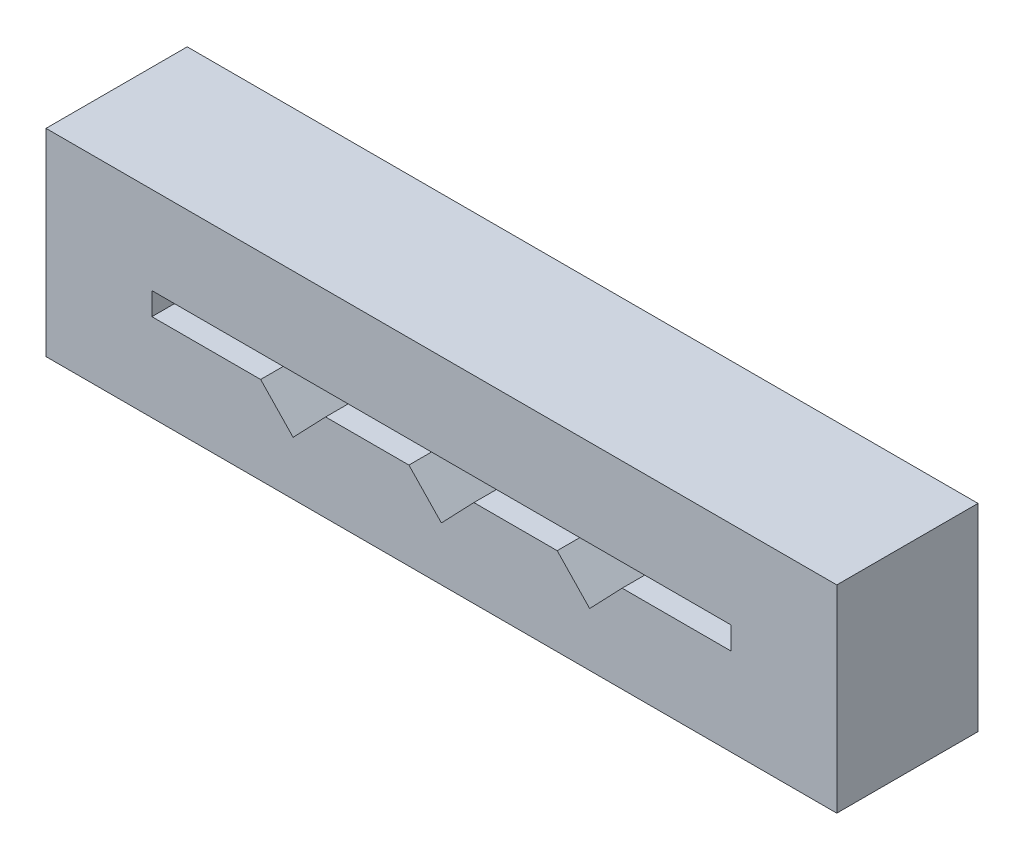
ISO-10303-21;
HEADER;
FILE_DESCRIPTION(('STEP AP214'),'2;1');
FILE_NAME('part.step','',(''),(''),'','','');
FILE_SCHEMA(('AUTOMOTIVE_DESIGN { 1 0 10303 214 1 1 1 1 }'));
ENDSEC;
DATA;
#1=APPLICATION_CONTEXT('core data for automotive mechanical design processes');
#2=APPLICATION_PROTOCOL_DEFINITION('international standard','automotive_design',2000,#1);
#3=PRODUCT_CONTEXT('',#1,'mechanical');
#4=PRODUCT('Part','Part','',(#3));
#5=PRODUCT_RELATED_PRODUCT_CATEGORY('part','',(#4));
#6=PRODUCT_DEFINITION_FORMATION('','',#4);
#7=PRODUCT_DEFINITION_CONTEXT('part definition',#1,'design');
#8=PRODUCT_DEFINITION('design','',#6,#7);
#9=PRODUCT_DEFINITION_SHAPE('','',#8);
#10=(LENGTH_UNIT() NAMED_UNIT(*) SI_UNIT(.MILLI.,.METRE.));
#11=(NAMED_UNIT(*) PLANE_ANGLE_UNIT() SI_UNIT($,.RADIAN.));
#12=(NAMED_UNIT(*) SI_UNIT($,.STERADIAN.) SOLID_ANGLE_UNIT());
#13=UNCERTAINTY_MEASURE_WITH_UNIT(LENGTH_MEASURE(1.E-05),#10,'distance_accuracy_value','');
#14=(GEOMETRIC_REPRESENTATION_CONTEXT(3) GLOBAL_UNCERTAINTY_ASSIGNED_CONTEXT((#13)) GLOBAL_UNIT_ASSIGNED_CONTEXT((#10,
#11,#12)) REPRESENTATION_CONTEXT('',''));
#15=CARTESIAN_POINT('',(0.,0.,0.));
#16=DIRECTION('',(0.,0.,1.));
#17=DIRECTION('',(1.,0.,0.));
#18=AXIS2_PLACEMENT_3D('',#15,#16,#17);
#19=CARTESIAN_POINT('',(-14.,3.5,5.));
#20=DIRECTION('',(1.,0.,0.));
#21=DIRECTION('',(0.,0.,-1.));
#22=AXIS2_PLACEMENT_3D('',#19,#20,#21);
#23=PLANE('',#22);
#24=DIRECTION('',(0.,-1.,0.));
#25=VECTOR('',#24,1.);
#26=CARTESIAN_POINT('',(-14.,3.5,0.));
#27=LINE('',#26,#25);
#28=CARTESIAN_POINT('',(-14.,3.5,0.));
#29=VERTEX_POINT('',#28);
#30=CARTESIAN_POINT('',(-14.,-3.5,0.));
#31=VERTEX_POINT('',#30);
#32=EDGE_CURVE('E259',#29,#31,#27,.T.);
#33=ORIENTED_EDGE('',*,*,#32,.T.);
#34=DIRECTION('',(0.,0.,-1.));
#35=VECTOR('',#34,1.);
#36=CARTESIAN_POINT('',(-14.,-3.5,5.));
#37=LINE('',#36,#35);
#38=CARTESIAN_POINT('',(-14.,-3.5,5.));
#39=VERTEX_POINT('',#38);
#40=EDGE_CURVE('E314',#39,#31,#37,.T.);
#41=ORIENTED_EDGE('',*,*,#40,.F.);
#42=DIRECTION('',(0.,-1.,0.));
#43=VECTOR('',#42,1.);
#44=CARTESIAN_POINT('',(-14.,3.5,5.));
#45=LINE('',#44,#43);
#46=CARTESIAN_POINT('',(-14.,3.5,5.));
#47=VERTEX_POINT('',#46);
#48=EDGE_CURVE('E288',#47,#39,#45,.T.);
#49=ORIENTED_EDGE('',*,*,#48,.F.);
#50=DIRECTION('',(0.,0.,-1.));
#51=VECTOR('',#50,1.);
#52=CARTESIAN_POINT('',(-14.,3.5,5.));
#53=LINE('',#52,#51);
#54=EDGE_CURVE('E298',#47,#29,#53,.T.);
#55=ORIENTED_EDGE('',*,*,#54,.T.);
#56=EDGE_LOOP('',(#33,#41,#49,#55));
#57=FACE_BOUND('',#56,.T.);
#58=ADVANCED_FACE('F35',(#57),#23,.F.);
#59=CARTESIAN_POINT('',(14.,-3.5,5.));
#60=DIRECTION('',(0.,1.,0.));
#61=DIRECTION('',(0.,0.,1.));
#62=AXIS2_PLACEMENT_3D('',#59,#60,#61);
#63=PLANE('',#62);
#64=DIRECTION('',(1.,0.,0.));
#65=VECTOR('',#64,1.);
#66=CARTESIAN_POINT('',(14.,-3.5,0.));
#67=LINE('',#66,#65);
#68=CARTESIAN_POINT('',(14.,-3.5,0.));
#69=VERTEX_POINT('',#68);
#70=EDGE_CURVE('E301',#31,#69,#67,.T.);
#71=ORIENTED_EDGE('',*,*,#70,.T.);
#72=DIRECTION('',(0.,0.,-1.));
#73=VECTOR('',#72,1.);
#74=CARTESIAN_POINT('',(14.,-3.5,5.));
#75=LINE('',#74,#73);
#76=CARTESIAN_POINT('',(14.,-3.5,5.));
#77=VERTEX_POINT('',#76);
#78=EDGE_CURVE('E311',#77,#69,#75,.T.);
#79=ORIENTED_EDGE('',*,*,#78,.F.);
#80=DIRECTION('',(1.,0.,0.));
#81=VECTOR('',#80,1.);
#82=CARTESIAN_POINT('',(14.,-3.5,5.));
#83=LINE('',#82,#81);
#84=EDGE_CURVE('E291',#39,#77,#83,.T.);
#85=ORIENTED_EDGE('',*,*,#84,.F.);
#86=ORIENTED_EDGE('',*,*,#40,.T.);
#87=EDGE_LOOP('',(#71,#79,#85,#86));
#88=FACE_BOUND('',#87,.T.);
#89=ADVANCED_FACE('F439',(#88),#63,.F.);
#90=CARTESIAN_POINT('',(14.,3.5,5.));
#91=DIRECTION('',(-1.,0.,0.));
#92=DIRECTION('',(0.,0.,1.));
#93=AXIS2_PLACEMENT_3D('',#90,#91,#92);
#94=PLANE('',#93);
#95=DIRECTION('',(0.,1.,0.));
#96=VECTOR('',#95,1.);
#97=CARTESIAN_POINT('',(14.,3.5,0.));
#98=LINE('',#97,#96);
#99=CARTESIAN_POINT('',(14.,3.5,0.));
#100=VERTEX_POINT('',#99);
#101=EDGE_CURVE('E303',#69,#100,#98,.T.);
#102=ORIENTED_EDGE('',*,*,#101,.T.);
#103=DIRECTION('',(0.,0.,-1.));
#104=VECTOR('',#103,1.);
#105=CARTESIAN_POINT('',(14.,3.5,5.));
#106=LINE('',#105,#104);
#107=CARTESIAN_POINT('',(14.,3.5,5.));
#108=VERTEX_POINT('',#107);
#109=EDGE_CURVE('E308',#108,#100,#106,.T.);
#110=ORIENTED_EDGE('',*,*,#109,.F.);
#111=DIRECTION('',(0.,1.,0.));
#112=VECTOR('',#111,1.);
#113=CARTESIAN_POINT('',(14.,3.5,5.));
#114=LINE('',#113,#112);
#115=EDGE_CURVE('E294',#77,#108,#114,.T.);
#116=ORIENTED_EDGE('',*,*,#115,.F.);
#117=ORIENTED_EDGE('',*,*,#78,.T.);
#118=EDGE_LOOP('',(#102,#110,#116,#117));
#119=FACE_BOUND('',#118,.T.);
#120=ADVANCED_FACE('F445',(#119),#94,.F.);
#121=CARTESIAN_POINT('',(14.,3.5,5.));
#122=DIRECTION('',(0.,-1.,0.));
#123=DIRECTION('',(0.,0.,-1.));
#124=AXIS2_PLACEMENT_3D('',#121,#122,#123);
#125=PLANE('',#124);
#126=DIRECTION('',(-1.,0.,0.));
#127=VECTOR('',#126,1.);
#128=CARTESIAN_POINT('',(14.,3.5,0.));
#129=LINE('',#128,#127);
#130=EDGE_CURVE('E292',#100,#29,#129,.T.);
#131=ORIENTED_EDGE('',*,*,#130,.T.);
#132=ORIENTED_EDGE('',*,*,#54,.F.);
#133=DIRECTION('',(-1.,0.,0.));
#134=VECTOR('',#133,1.);
#135=CARTESIAN_POINT('',(14.,3.5,5.));
#136=LINE('',#135,#134);
#137=EDGE_CURVE('E296',#108,#47,#136,.T.);
#138=ORIENTED_EDGE('',*,*,#137,.F.);
#139=ORIENTED_EDGE('',*,*,#109,.T.);
#140=EDGE_LOOP('',(#131,#132,#138,#139));
#141=FACE_BOUND('',#140,.T.);
#142=ADVANCED_FACE('F571',(#141),#125,.F.);
#143=CARTESIAN_POINT('',(0.,0.,5.));
#144=DIRECTION('',(0.,0.,-1.));
#145=DIRECTION('',(-1.,0.,0.));
#146=AXIS2_PLACEMENT_3D('',#143,#144,#145);
#147=PLANE('',#146);
#148=DIRECTION('',(0.,-1.,0.));
#149=VECTOR('',#148,1.);
#150=CARTESIAN_POINT('',(10.25,-0.4,5.));
#151=LINE('',#150,#149);
#152=CARTESIAN_POINT('',(10.25,0.4,5.));
#153=VERTEX_POINT('',#152);
#154=CARTESIAN_POINT('',(10.25,-0.4,5.));
#155=VERTEX_POINT('',#154);
#156=EDGE_CURVE('E198',#153,#155,#151,.T.);
#157=ORIENTED_EDGE('',*,*,#156,.T.);
#158=DIRECTION('',(-1.,0.,0.));
#159=VECTOR('',#158,1.);
#160=CARTESIAN_POINT('',(6.4,-0.400000000000023,5.));
#161=LINE('',#160,#159);
#162=CARTESIAN_POINT('',(6.4,-0.400000000000023,5.));
#163=VERTEX_POINT('',#162);
#164=EDGE_CURVE('E192',#155,#163,#161,.T.);
#165=ORIENTED_EDGE('',*,*,#164,.T.);
#166=DIRECTION('',(-0.691905363235615,-0.721988205115424,0.));
#167=VECTOR('',#166,1.);
#168=CARTESIAN_POINT('',(6.4,-0.400000000000023,5.));
#169=LINE('',#168,#167);
#170=CARTESIAN_POINT('',(5.25,-1.60000000000002,5.));
#171=VERTEX_POINT('',#170);
#172=EDGE_CURVE('E202',#163,#171,#169,.T.);
#173=ORIENTED_EDGE('',*,*,#172,.T.);
#174=DIRECTION('',(-0.691905363235615,0.721988205115424,0.));
#175=VECTOR('',#174,1.);
#176=CARTESIAN_POINT('',(5.25,-1.60000000000002,5.));
#177=LINE('',#176,#175);
#178=CARTESIAN_POINT('',(4.1,-0.400000000000023,5.));
#179=VERTEX_POINT('',#178);
#180=EDGE_CURVE('E207',#171,#179,#177,.T.);
#181=ORIENTED_EDGE('',*,*,#180,.T.);
#182=DIRECTION('',(-1.,0.,0.));
#183=VECTOR('',#182,1.);
#184=CARTESIAN_POINT('',(4.1,-0.400000000000023,5.));
#185=LINE('',#184,#183);
#186=CARTESIAN_POINT('',(1.15,-0.400000000000023,5.));
#187=VERTEX_POINT('',#186);
#188=EDGE_CURVE('E219',#179,#187,#185,.T.);
#189=ORIENTED_EDGE('',*,*,#188,.T.);
#190=DIRECTION('',(-0.691905363235615,-0.721988205115424,0.));
#191=VECTOR('',#190,1.);
#192=CARTESIAN_POINT('',(1.15,-0.400000000000023,5.));
#193=LINE('',#192,#191);
#194=CARTESIAN_POINT('',(0.,-1.60000000000002,5.));
#195=VERTEX_POINT('',#194);
#196=EDGE_CURVE('E222',#187,#195,#193,.T.);
#197=ORIENTED_EDGE('',*,*,#196,.T.);
#198=DIRECTION('',(-0.691905363235615,0.721988205115424,0.));
#199=VECTOR('',#198,1.);
#200=CARTESIAN_POINT('',(0.,-1.60000000000002,5.));
#201=LINE('',#200,#199);
#202=CARTESIAN_POINT('',(-1.15,-0.400000000000023,5.));
#203=VERTEX_POINT('',#202);
#204=EDGE_CURVE('E225',#195,#203,#201,.T.);
#205=ORIENTED_EDGE('',*,*,#204,.T.);
#206=DIRECTION('',(-1.,0.,0.));
#207=VECTOR('',#206,1.);
#208=CARTESIAN_POINT('',(-1.15,-0.400000000000023,5.));
#209=LINE('',#208,#207);
#210=CARTESIAN_POINT('',(-4.1,-0.400000000000023,5.));
#211=VERTEX_POINT('',#210);
#212=EDGE_CURVE('E228',#203,#211,#209,.T.);
#213=ORIENTED_EDGE('',*,*,#212,.T.);
#214=DIRECTION('',(-0.691905363235615,-0.721988205115425,0.));
#215=VECTOR('',#214,1.);
#216=CARTESIAN_POINT('',(-4.1,-0.400000000000023,5.));
#217=LINE('',#216,#215);
#218=CARTESIAN_POINT('',(-5.25,-1.60000000000002,5.));
#219=VERTEX_POINT('',#218);
#220=EDGE_CURVE('E231',#211,#219,#217,.T.);
#221=ORIENTED_EDGE('',*,*,#220,.T.);
#222=DIRECTION('',(-0.6919053632356,0.721988205115438,0.));
#223=VECTOR('',#222,1.);
#224=CARTESIAN_POINT('',(-5.25,-1.60000000000002,5.));
#225=LINE('',#224,#223);
#226=CARTESIAN_POINT('',(-6.39999999999998,-0.4,5.));
#227=VERTEX_POINT('',#226);
#228=EDGE_CURVE('E234',#219,#227,#225,.T.);
#229=ORIENTED_EDGE('',*,*,#228,.T.);
#230=DIRECTION('',(-1.,0.,0.));
#231=VECTOR('',#230,1.);
#232=CARTESIAN_POINT('',(-6.39999999999998,-0.4,5.));
#233=LINE('',#232,#231);
#234=CARTESIAN_POINT('',(-10.25,-0.4,5.));
#235=VERTEX_POINT('',#234);
#236=EDGE_CURVE('E237',#227,#235,#233,.T.);
#237=ORIENTED_EDGE('',*,*,#236,.T.);
#238=DIRECTION('',(0.,1.,0.));
#239=VECTOR('',#238,1.);
#240=CARTESIAN_POINT('',(-10.25,-0.4,5.));
#241=LINE('',#240,#239);
#242=CARTESIAN_POINT('',(-10.25,0.4,5.));
#243=VERTEX_POINT('',#242);
#244=EDGE_CURVE('E240',#235,#243,#241,.T.);
#245=ORIENTED_EDGE('',*,*,#244,.T.);
#246=DIRECTION('',(1.,0.,0.));
#247=VECTOR('',#246,1.);
#248=CARTESIAN_POINT('',(10.25,0.4,5.));
#249=LINE('',#248,#247);
#250=EDGE_CURVE('E243',#243,#153,#249,.T.);
#251=ORIENTED_EDGE('',*,*,#250,.T.);
#252=EDGE_LOOP('',(#157,#165,#173,#181,#189,#197,#205,#213,#221,#229,#237,#245,#251));
#253=FACE_BOUND('',#252,.T.);
#254=ORIENTED_EDGE('',*,*,#48,.T.);
#255=ORIENTED_EDGE('',*,*,#84,.T.);
#256=ORIENTED_EDGE('',*,*,#115,.T.);
#257=ORIENTED_EDGE('',*,*,#137,.T.);
#258=EDGE_LOOP('',(#254,#255,#256,#257));
#259=FACE_BOUND('',#258,.T.);
#260=ADVANCED_FACE('F209',(#253,#259),#147,.F.);
#261=CARTESIAN_POINT('',(0.,0.,0.));
#262=DIRECTION('',(0.,0.,-1.));
#263=DIRECTION('',(-1.,0.,0.));
#264=AXIS2_PLACEMENT_3D('',#261,#262,#263);
#265=PLANE('',#264);
#266=DIRECTION('',(-0.691905363235615,-0.721988205115425,0.));
#267=VECTOR('',#266,1.);
#268=CARTESIAN_POINT('',(-4.1,-0.400000000000023,0.));
#269=LINE('',#268,#267);
#270=CARTESIAN_POINT('',(-4.57916666666667,-0.900000000000024,0.));
#271=VERTEX_POINT('',#270);
#272=CARTESIAN_POINT('',(-5.25,-1.60000000000002,0.));
#273=VERTEX_POINT('',#272);
#274=EDGE_CURVE('E215',#271,#273,#269,.T.);
#275=ORIENTED_EDGE('',*,*,#274,.F.);
#276=DIRECTION('',(1.,0.,0.));
#277=VECTOR('',#276,1.);
#278=CARTESIAN_POINT('',(-1.15,-0.900000000000023,0.));
#279=LINE('',#278,#277);
#280=CARTESIAN_POINT('',(-0.670833333333333,-0.900000000000023,0.));
#281=VERTEX_POINT('',#280);
#282=EDGE_CURVE('E334',#271,#281,#279,.T.);
#283=ORIENTED_EDGE('',*,*,#282,.T.);
#284=DIRECTION('',(-0.691905363235615,0.721988205115424,0.));
#285=VECTOR('',#284,1.);
#286=CARTESIAN_POINT('',(0.,-1.60000000000002,0.));
#287=LINE('',#286,#285);
#288=CARTESIAN_POINT('',(0.,-1.60000000000002,0.));
#289=VERTEX_POINT('',#288);
#290=EDGE_CURVE('E253',#289,#281,#287,.T.);
#291=ORIENTED_EDGE('',*,*,#290,.F.);
#292=DIRECTION('',(-0.691905363235615,-0.721988205115424,0.));
#293=VECTOR('',#292,1.);
#294=CARTESIAN_POINT('',(1.15,-0.400000000000023,0.));
#295=LINE('',#294,#293);
#296=CARTESIAN_POINT('',(0.670833333333333,-0.900000000000023,0.));
#297=VERTEX_POINT('',#296);
#298=EDGE_CURVE('E251',#297,#289,#295,.T.);
#299=ORIENTED_EDGE('',*,*,#298,.F.);
#300=DIRECTION('',(1.,0.,0.));
#301=VECTOR('',#300,1.);
#302=CARTESIAN_POINT('',(4.1,-0.900000000000023,0.));
#303=LINE('',#302,#301);
#304=CARTESIAN_POINT('',(4.57916666666667,-0.900000000000023,0.));
#305=VERTEX_POINT('',#304);
#306=EDGE_CURVE('E332',#297,#305,#303,.T.);
#307=ORIENTED_EDGE('',*,*,#306,.T.);
#308=DIRECTION('',(-0.691905363235615,0.721988205115424,0.));
#309=VECTOR('',#308,1.);
#310=CARTESIAN_POINT('',(5.25,-1.60000000000002,0.));
#311=LINE('',#310,#309);
#312=CARTESIAN_POINT('',(5.25,-1.60000000000002,0.));
#313=VERTEX_POINT('',#312);
#314=EDGE_CURVE('E248',#313,#305,#311,.T.);
#315=ORIENTED_EDGE('',*,*,#314,.F.);
#316=DIRECTION('',(-0.691905363235615,-0.721988205115424,0.));
#317=VECTOR('',#316,1.);
#318=CARTESIAN_POINT('',(6.4,-0.400000000000023,0.));
#319=LINE('',#318,#317);
#320=CARTESIAN_POINT('',(5.92083333333333,-0.900000000000026,0.));
#321=VERTEX_POINT('',#320);
#322=EDGE_CURVE('E246',#321,#313,#319,.T.);
#323=ORIENTED_EDGE('',*,*,#322,.F.);
#324=DIRECTION('',(1.,0.,0.));
#325=VECTOR('',#324,1.);
#326=CARTESIAN_POINT('',(10.25,-0.9,0.));
#327=LINE('',#326,#325);
#328=CARTESIAN_POINT('',(10.75,-0.899999999999997,0.));
#329=VERTEX_POINT('',#328);
#330=EDGE_CURVE('E330',#321,#329,#327,.T.);
#331=ORIENTED_EDGE('',*,*,#330,.T.);
#332=DIRECTION('',(0.,1.,0.));
#333=VECTOR('',#332,1.);
#334=CARTESIAN_POINT('',(10.75,0.4,0.));
#335=LINE('',#334,#333);
#336=CARTESIAN_POINT('',(10.75,0.9,0.));
#337=VERTEX_POINT('',#336);
#338=EDGE_CURVE('E328',#329,#337,#335,.T.);
#339=ORIENTED_EDGE('',*,*,#338,.T.);
#340=DIRECTION('',(-1.,0.,0.));
#341=VECTOR('',#340,1.);
#342=CARTESIAN_POINT('',(-10.25,0.9,0.));
#343=LINE('',#342,#341);
#344=CARTESIAN_POINT('',(-10.75,0.9,0.));
#345=VERTEX_POINT('',#344);
#346=EDGE_CURVE('E322',#337,#345,#343,.T.);
#347=ORIENTED_EDGE('',*,*,#346,.T.);
#348=DIRECTION('',(0.,-1.,0.));
#349=VECTOR('',#348,1.);
#350=CARTESIAN_POINT('',(-10.75,-0.4,0.));
#351=LINE('',#350,#349);
#352=CARTESIAN_POINT('',(-10.75,-0.9,0.));
#353=VERTEX_POINT('',#352);
#354=EDGE_CURVE('E324',#345,#353,#351,.T.);
#355=ORIENTED_EDGE('',*,*,#354,.T.);
#356=DIRECTION('',(1.,0.,0.));
#357=VECTOR('',#356,1.);
#358=CARTESIAN_POINT('',(-6.39999999999998,-0.9,0.));
#359=LINE('',#358,#357);
#360=CARTESIAN_POINT('',(-5.92083333333333,-0.9,0.));
#361=VERTEX_POINT('',#360);
#362=EDGE_CURVE('E326',#353,#361,#359,.T.);
#363=ORIENTED_EDGE('',*,*,#362,.T.);
#364=DIRECTION('',(-0.6919053632356,0.721988205115438,0.));
#365=VECTOR('',#364,1.);
#366=CARTESIAN_POINT('',(-5.25,-1.60000000000002,0.));
#367=LINE('',#366,#365);
#368=EDGE_CURVE('E213',#273,#361,#367,.T.);
#369=ORIENTED_EDGE('',*,*,#368,.F.);
#370=EDGE_LOOP('',(#275,#283,#291,#299,#307,#315,#323,#331,#339,#347,#355,#363,#369));
#371=FACE_BOUND('',#370,.T.);
#372=ORIENTED_EDGE('',*,*,#32,.F.);
#373=ORIENTED_EDGE('',*,*,#130,.F.);
#374=ORIENTED_EDGE('',*,*,#101,.F.);
#375=ORIENTED_EDGE('',*,*,#70,.F.);
#376=EDGE_LOOP('',(#372,#373,#374,#375));
#377=FACE_BOUND('',#376,.T.);
#378=ADVANCED_FACE('F376',(#371,#377),#265,.T.);
#379=CARTESIAN_POINT('',(6.4,-0.400000000000023,5.));
#380=DIRECTION('',(0.,-1.,0.));
#381=DIRECTION('',(1.,0.,0.));
#382=AXIS2_PLACEMENT_3D('',#379,#380,#381);
#383=PLANE('',#382);
#384=DIRECTION('',(0.,0.,-1.));
#385=VECTOR('',#384,1.);
#386=CARTESIAN_POINT('',(10.25,-0.4,5.));
#387=LINE('',#386,#385);
#388=CARTESIAN_POINT('',(10.25,-0.4,0.5));
#389=VERTEX_POINT('',#388);
#390=EDGE_CURVE('E257',#155,#389,#387,.T.);
#391=ORIENTED_EDGE('',*,*,#390,.T.);
#392=DIRECTION('',(-1.,0.,0.));
#393=VECTOR('',#392,1.);
#394=CARTESIAN_POINT('',(6.4,-0.400000000000023,0.5));
#395=LINE('',#394,#393);
#396=CARTESIAN_POINT('',(6.4,-0.400000000000023,0.5));
#397=VERTEX_POINT('',#396);
#398=EDGE_CURVE('E195',#389,#397,#395,.T.);
#399=ORIENTED_EDGE('',*,*,#398,.T.);
#400=DIRECTION('',(0.,0.,-1.));
#401=VECTOR('',#400,1.);
#402=CARTESIAN_POINT('',(6.4,-0.400000000000023,5.));
#403=LINE('',#402,#401);
#404=EDGE_CURVE('E187',#163,#397,#403,.T.);
#405=ORIENTED_EDGE('',*,*,#404,.F.);
#406=ORIENTED_EDGE('',*,*,#164,.F.);
#407=EDGE_LOOP('',(#391,#399,#405,#406));
#408=FACE_BOUND('',#407,.T.);
#409=ADVANCED_FACE('F190',(#408),#383,.F.);
#410=CARTESIAN_POINT('',(10.25,-0.4,5.));
#411=DIRECTION('',(1.,0.,0.));
#412=DIRECTION('',(0.,0.,-1.));
#413=AXIS2_PLACEMENT_3D('',#410,#411,#412);
#414=PLANE('',#413);
#415=DIRECTION('',(0.,0.,-1.));
#416=VECTOR('',#415,1.);
#417=CARTESIAN_POINT('',(10.25,0.4,5.));
#418=LINE('',#417,#416);
#419=CARTESIAN_POINT('',(10.25,0.4,0.5));
#420=VERTEX_POINT('',#419);
#421=EDGE_CURVE('E260',#153,#420,#418,.T.);
#422=ORIENTED_EDGE('',*,*,#421,.T.);
#423=DIRECTION('',(0.,-1.,0.));
#424=VECTOR('',#423,1.);
#425=CARTESIAN_POINT('',(10.25,-0.4,0.5));
#426=LINE('',#425,#424);
#427=EDGE_CURVE('E348',#420,#389,#426,.T.);
#428=ORIENTED_EDGE('',*,*,#427,.T.);
#429=ORIENTED_EDGE('',*,*,#390,.F.);
#430=ORIENTED_EDGE('',*,*,#156,.F.);
#431=EDGE_LOOP('',(#422,#428,#429,#430));
#432=FACE_BOUND('',#431,.T.);
#433=ADVANCED_FACE('F424',(#432),#414,.F.);
#434=CARTESIAN_POINT('',(10.25,0.4,5.));
#435=DIRECTION('',(0.,1.,0.));
#436=DIRECTION('',(0.,0.,1.));
#437=AXIS2_PLACEMENT_3D('',#434,#435,#436);
#438=PLANE('',#437);
#439=DIRECTION('',(0.,0.,-1.));
#440=VECTOR('',#439,1.);
#441=CARTESIAN_POINT('',(-10.25,0.4,5.));
#442=LINE('',#441,#440);
#443=CARTESIAN_POINT('',(-10.25,0.4,0.5));
#444=VERTEX_POINT('',#443);
#445=EDGE_CURVE('E263',#243,#444,#442,.T.);
#446=ORIENTED_EDGE('',*,*,#445,.T.);
#447=DIRECTION('',(1.,0.,0.));
#448=VECTOR('',#447,1.);
#449=CARTESIAN_POINT('',(10.25,0.4,0.5));
#450=LINE('',#449,#448);
#451=EDGE_CURVE('E11',#444,#420,#450,.T.);
#452=ORIENTED_EDGE('',*,*,#451,.T.);
#453=ORIENTED_EDGE('',*,*,#421,.F.);
#454=ORIENTED_EDGE('',*,*,#250,.F.);
#455=EDGE_LOOP('',(#446,#452,#453,#454));
#456=FACE_BOUND('',#455,.T.);
#457=ADVANCED_FACE('F421',(#456),#438,.F.);
#458=CARTESIAN_POINT('',(-10.25,-0.4,5.));
#459=DIRECTION('',(-1.,0.,0.));
#460=DIRECTION('',(0.,0.,1.));
#461=AXIS2_PLACEMENT_3D('',#458,#459,#460);
#462=PLANE('',#461);
#463=DIRECTION('',(0.,0.,-1.));
#464=VECTOR('',#463,1.);
#465=CARTESIAN_POINT('',(-10.25,-0.4,5.));
#466=LINE('',#465,#464);
#467=CARTESIAN_POINT('',(-10.25,-0.4,0.5));
#468=VERTEX_POINT('',#467);
#469=EDGE_CURVE('E265',#235,#468,#466,.T.);
#470=ORIENTED_EDGE('',*,*,#469,.T.);
#471=DIRECTION('',(0.,1.,0.));
#472=VECTOR('',#471,1.);
#473=CARTESIAN_POINT('',(-10.25,0.4,0.5));
#474=LINE('',#473,#472);
#475=EDGE_CURVE('E44',#468,#444,#474,.T.);
#476=ORIENTED_EDGE('',*,*,#475,.T.);
#477=ORIENTED_EDGE('',*,*,#445,.F.);
#478=ORIENTED_EDGE('',*,*,#244,.F.);
#479=EDGE_LOOP('',(#470,#476,#477,#478));
#480=FACE_BOUND('',#479,.T.);
#481=ADVANCED_FACE('F427',(#480),#462,.F.);
#482=CARTESIAN_POINT('',(-6.39999999999998,-0.4,5.));
#483=DIRECTION('',(0.,-1.,0.));
#484=DIRECTION('',(0.,0.,-1.));
#485=AXIS2_PLACEMENT_3D('',#482,#483,#484);
#486=PLANE('',#485);
#487=DIRECTION('',(0.,0.,-1.));
#488=VECTOR('',#487,1.);
#489=CARTESIAN_POINT('',(-6.39999999999998,-0.4,5.));
#490=LINE('',#489,#488);
#491=CARTESIAN_POINT('',(-6.39999999999998,-0.4,0.5));
#492=VERTEX_POINT('',#491);
#493=EDGE_CURVE('E267',#227,#492,#490,.T.);
#494=ORIENTED_EDGE('',*,*,#493,.T.);
#495=DIRECTION('',(-1.,0.,0.));
#496=VECTOR('',#495,1.);
#497=CARTESIAN_POINT('',(-10.25,-0.4,0.5));
#498=LINE('',#497,#496);
#499=EDGE_CURVE('E350',#492,#468,#498,.T.);
#500=ORIENTED_EDGE('',*,*,#499,.T.);
#501=ORIENTED_EDGE('',*,*,#469,.F.);
#502=ORIENTED_EDGE('',*,*,#236,.F.);
#503=EDGE_LOOP('',(#494,#500,#501,#502));
#504=FACE_BOUND('',#503,.T.);
#505=ADVANCED_FACE('F429',(#504),#486,.F.);
#506=CARTESIAN_POINT('',(-5.25,-1.60000000000002,5.));
#507=DIRECTION('',(-0.721988205115438,-0.6919053632356,0.));
#508=DIRECTION('',(0.6919053632356,-0.721988205115438,0.));
#509=AXIS2_PLACEMENT_3D('',#506,#507,#508);
#510=PLANE('',#509);
#511=ORIENTED_EDGE('',*,*,#368,.T.);
#512=DIRECTION('',(-0.560975609756082,0.585365853658544,0.585365853658544));
#513=VECTOR('',#512,1.);
#514=CARTESIAN_POINT('',(-6.39999999999998,-0.4,0.5));
#515=LINE('',#514,#513);
#516=EDGE_CURVE('E59',#361,#492,#515,.T.);
#517=ORIENTED_EDGE('',*,*,#516,.T.);
#518=ORIENTED_EDGE('',*,*,#493,.F.);
#519=ORIENTED_EDGE('',*,*,#228,.F.);
#520=DIRECTION('',(0.,0.,-1.));
#521=VECTOR('',#520,1.);
#522=CARTESIAN_POINT('',(-5.25,-1.60000000000002,5.));
#523=LINE('',#522,#521);
#524=EDGE_CURVE('E269',#219,#273,#523,.T.);
#525=ORIENTED_EDGE('',*,*,#524,.T.);
#526=EDGE_LOOP('',(#511,#517,#518,#519,#525));
#527=FACE_BOUND('',#526,.T.);
#528=ADVANCED_FACE('F378',(#527),#510,.F.);
#529=CARTESIAN_POINT('',(-4.1,-0.400000000000023,5.));
#530=DIRECTION('',(0.721988205115425,-0.691905363235615,0.));
#531=DIRECTION('',(0.691905363235615,0.721988205115425,0.));
#532=AXIS2_PLACEMENT_3D('',#529,#530,#531);
#533=PLANE('',#532);
#534=DIRECTION('',(0.,0.,-1.));
#535=VECTOR('',#534,1.);
#536=CARTESIAN_POINT('',(-4.1,-0.400000000000023,5.));
#537=LINE('',#536,#535);
#538=CARTESIAN_POINT('',(-4.1,-0.400000000000023,0.5));
#539=VERTEX_POINT('',#538);
#540=EDGE_CURVE('E272',#211,#539,#537,.T.);
#541=ORIENTED_EDGE('',*,*,#540,.T.);
#542=DIRECTION('',(-0.560975609756097,-0.585365853658537,-0.585365853658537));
#543=VECTOR('',#542,1.);
#544=CARTESIAN_POINT('',(-3.17165377751339,0.568709101725141,1.46870910172516));
#545=LINE('',#544,#543);
#546=EDGE_CURVE('E320',#539,#271,#545,.T.);
#547=ORIENTED_EDGE('',*,*,#546,.T.);
#548=ORIENTED_EDGE('',*,*,#274,.T.);
#549=ORIENTED_EDGE('',*,*,#524,.F.);
#550=ORIENTED_EDGE('',*,*,#220,.F.);
#551=EDGE_LOOP('',(#541,#547,#548,#549,#550));
#552=FACE_BOUND('',#551,.T.);
#553=ADVANCED_FACE('F382',(#552),#533,.F.);
#554=CARTESIAN_POINT('',(-1.15,-0.400000000000023,5.));
#555=DIRECTION('',(0.,-1.,0.));
#556=DIRECTION('',(1.,0.,0.));
#557=AXIS2_PLACEMENT_3D('',#554,#555,#556);
#558=PLANE('',#557);
#559=DIRECTION('',(0.,0.,-1.));
#560=VECTOR('',#559,1.);
#561=CARTESIAN_POINT('',(-1.15,-0.400000000000023,5.));
#562=LINE('',#561,#560);
#563=CARTESIAN_POINT('',(-1.15,-0.400000000000023,0.5));
#564=VERTEX_POINT('',#563);
#565=EDGE_CURVE('E275',#203,#564,#562,.T.);
#566=ORIENTED_EDGE('',*,*,#565,.T.);
#567=DIRECTION('',(-1.,0.,0.));
#568=VECTOR('',#567,1.);
#569=CARTESIAN_POINT('',(-4.1,-0.400000000000023,0.5));
#570=LINE('',#569,#568);
#571=EDGE_CURVE('E317',#564,#539,#570,.T.);
#572=ORIENTED_EDGE('',*,*,#571,.T.);
#573=ORIENTED_EDGE('',*,*,#540,.F.);
#574=ORIENTED_EDGE('',*,*,#212,.F.);
#575=EDGE_LOOP('',(#566,#572,#573,#574));
#576=FACE_BOUND('',#575,.T.);
#577=ADVANCED_FACE('F394',(#576),#558,.F.);
#578=CARTESIAN_POINT('',(0.,-1.60000000000002,5.));
#579=DIRECTION('',(-0.721988205115424,-0.691905363235615,0.));
#580=DIRECTION('',(0.691905363235615,-0.721988205115424,0.));
#581=AXIS2_PLACEMENT_3D('',#578,#579,#580);
#582=PLANE('',#581);
#583=ORIENTED_EDGE('',*,*,#290,.T.);
#584=DIRECTION('',(-0.560975609756098,0.585365853658537,0.585365853658537));
#585=VECTOR('',#584,1.);
#586=CARTESIAN_POINT('',(-1.15,-0.400000000000023,0.5));
#587=LINE('',#586,#585);
#588=EDGE_CURVE('E336',#281,#564,#587,.T.);
#589=ORIENTED_EDGE('',*,*,#588,.T.);
#590=ORIENTED_EDGE('',*,*,#565,.F.);
#591=ORIENTED_EDGE('',*,*,#204,.F.);
#592=DIRECTION('',(0.,0.,-1.));
#593=VECTOR('',#592,1.);
#594=CARTESIAN_POINT('',(0.,-1.60000000000002,5.));
#595=LINE('',#594,#593);
#596=EDGE_CURVE('E278',#195,#289,#595,.T.);
#597=ORIENTED_EDGE('',*,*,#596,.T.);
#598=EDGE_LOOP('',(#583,#589,#590,#591,#597));
#599=FACE_BOUND('',#598,.T.);
#600=ADVANCED_FACE('F390',(#599),#582,.F.);
#601=CARTESIAN_POINT('',(1.15,-0.400000000000023,5.));
#602=DIRECTION('',(0.721988205115424,-0.691905363235615,0.));
#603=DIRECTION('',(0.691905363235615,0.721988205115424,0.));
#604=AXIS2_PLACEMENT_3D('',#601,#602,#603);
#605=PLANE('',#604);
#606=DIRECTION('',(0.,0.,-1.));
#607=VECTOR('',#606,1.);
#608=CARTESIAN_POINT('',(1.15,-0.400000000000023,5.));
#609=LINE('',#608,#607);
#610=CARTESIAN_POINT('',(1.15,-0.400000000000023,0.5));
#611=VERTEX_POINT('',#610);
#612=EDGE_CURVE('E281',#187,#611,#609,.T.);
#613=ORIENTED_EDGE('',*,*,#612,.T.);
#614=DIRECTION('',(-0.560975609756098,-0.585365853658537,-0.585365853658537));
#615=VECTOR('',#614,1.);
#616=CARTESIAN_POINT('',(2.07834622248662,0.568709101725141,1.46870910172516));
#617=LINE('',#616,#615);
#618=EDGE_CURVE('E341',#611,#297,#617,.T.);
#619=ORIENTED_EDGE('',*,*,#618,.T.);
#620=ORIENTED_EDGE('',*,*,#298,.T.);
#621=ORIENTED_EDGE('',*,*,#596,.F.);
#622=ORIENTED_EDGE('',*,*,#196,.F.);
#623=EDGE_LOOP('',(#613,#619,#620,#621,#622));
#624=FACE_BOUND('',#623,.T.);
#625=ADVANCED_FACE('F491',(#624),#605,.F.);
#626=CARTESIAN_POINT('',(4.1,-0.400000000000023,5.));
#627=DIRECTION('',(0.,-1.,0.));
#628=DIRECTION('',(1.,0.,0.));
#629=AXIS2_PLACEMENT_3D('',#626,#627,#628);
#630=PLANE('',#629);
#631=DIRECTION('',(0.,0.,-1.));
#632=VECTOR('',#631,1.);
#633=CARTESIAN_POINT('',(4.1,-0.400000000000023,5.));
#634=LINE('',#633,#632);
#635=CARTESIAN_POINT('',(4.1,-0.400000000000023,0.5));
#636=VERTEX_POINT('',#635);
#637=EDGE_CURVE('E284',#179,#636,#634,.T.);
#638=ORIENTED_EDGE('',*,*,#637,.T.);
#639=DIRECTION('',(-1.,0.,0.));
#640=VECTOR('',#639,1.);
#641=CARTESIAN_POINT('',(1.15,-0.400000000000023,0.5));
#642=LINE('',#641,#640);
#643=EDGE_CURVE('E338',#636,#611,#642,.T.);
#644=ORIENTED_EDGE('',*,*,#643,.T.);
#645=ORIENTED_EDGE('',*,*,#612,.F.);
#646=ORIENTED_EDGE('',*,*,#188,.F.);
#647=EDGE_LOOP('',(#638,#644,#645,#646));
#648=FACE_BOUND('',#647,.T.);
#649=ADVANCED_FACE('F408',(#648),#630,.F.);
#650=CARTESIAN_POINT('',(5.25,-1.60000000000002,5.));
#651=DIRECTION('',(-0.721988205115424,-0.691905363235615,0.));
#652=DIRECTION('',(0.691905363235615,-0.721988205115424,0.));
#653=AXIS2_PLACEMENT_3D('',#650,#651,#652);
#654=PLANE('',#653);
#655=ORIENTED_EDGE('',*,*,#314,.T.);
#656=DIRECTION('',(-0.560975609756098,0.585365853658537,0.585365853658537));
#657=VECTOR('',#656,1.);
#658=CARTESIAN_POINT('',(4.1,-0.400000000000023,0.5));
#659=LINE('',#658,#657);
#660=EDGE_CURVE('E343',#305,#636,#659,.T.);
#661=ORIENTED_EDGE('',*,*,#660,.T.);
#662=ORIENTED_EDGE('',*,*,#637,.F.);
#663=ORIENTED_EDGE('',*,*,#180,.F.);
#664=DIRECTION('',(0.,0.,-1.));
#665=VECTOR('',#664,1.);
#666=CARTESIAN_POINT('',(5.25,-1.60000000000002,5.));
#667=LINE('',#666,#665);
#668=EDGE_CURVE('E197',#171,#313,#667,.T.);
#669=ORIENTED_EDGE('',*,*,#668,.T.);
#670=EDGE_LOOP('',(#655,#661,#662,#663,#669));
#671=FACE_BOUND('',#670,.T.);
#672=ADVANCED_FACE('F405',(#671),#654,.F.);
#673=CARTESIAN_POINT('',(6.4,-0.400000000000023,5.));
#674=DIRECTION('',(0.721988205115424,-0.691905363235615,0.));
#675=DIRECTION('',(0.691905363235615,0.721988205115424,0.));
#676=AXIS2_PLACEMENT_3D('',#673,#674,#675);
#677=PLANE('',#676);
#678=ORIENTED_EDGE('',*,*,#404,.T.);
#679=DIRECTION('',(-0.560975609756099,-0.585365853658538,-0.585365853658534));
#680=VECTOR('',#679,1.);
#681=CARTESIAN_POINT('',(6.4,-0.400000000000023,0.5));
#682=LINE('',#681,#680);
#683=EDGE_CURVE('E346',#397,#321,#682,.T.);
#684=ORIENTED_EDGE('',*,*,#683,.T.);
#685=ORIENTED_EDGE('',*,*,#322,.T.);
#686=ORIENTED_EDGE('',*,*,#668,.F.);
#687=ORIENTED_EDGE('',*,*,#172,.F.);
#688=EDGE_LOOP('',(#678,#684,#685,#686,#687));
#689=FACE_BOUND('',#688,.T.);
#690=ADVANCED_FACE('F203',(#689),#677,.F.);
#691=CARTESIAN_POINT('',(-1.15,-0.400000000000023,0.5));
#692=DIRECTION('',(0.,0.707106781186548,-0.707106781186547));
#693=DIRECTION('',(1.,0.,0.));
#694=AXIS2_PLACEMENT_3D('',#691,#692,#693);
#695=PLANE('',#694);
#696=ORIENTED_EDGE('',*,*,#588,.F.);
#697=ORIENTED_EDGE('',*,*,#282,.F.);
#698=ORIENTED_EDGE('',*,*,#546,.F.);
#699=ORIENTED_EDGE('',*,*,#571,.F.);
#700=EDGE_LOOP('',(#696,#697,#698,#699));
#701=FACE_BOUND('',#700,.T.);
#702=ADVANCED_FACE('F387',(#701),#695,.T.);
#703=CARTESIAN_POINT('',(4.1,-0.400000000000023,0.5));
#704=DIRECTION('',(0.,0.707106781186548,-0.707106781186547));
#705=DIRECTION('',(1.,0.,0.));
#706=AXIS2_PLACEMENT_3D('',#703,#704,#705);
#707=PLANE('',#706);
#708=ORIENTED_EDGE('',*,*,#660,.F.);
#709=ORIENTED_EDGE('',*,*,#306,.F.);
#710=ORIENTED_EDGE('',*,*,#618,.F.);
#711=ORIENTED_EDGE('',*,*,#643,.F.);
#712=EDGE_LOOP('',(#708,#709,#710,#711));
#713=FACE_BOUND('',#712,.T.);
#714=ADVANCED_FACE('F402',(#713),#707,.T.);
#715=CARTESIAN_POINT('',(-6.39999999999998,-0.4,0.5));
#716=DIRECTION('',(0.,0.707106781186547,-0.707106781186547));
#717=DIRECTION('',(1.,0.,0.));
#718=AXIS2_PLACEMENT_3D('',#715,#716,#717);
#719=PLANE('',#718);
#720=ORIENTED_EDGE('',*,*,#516,.F.);
#721=ORIENTED_EDGE('',*,*,#362,.F.);
#722=DIRECTION('',(-0.577350269189626,-0.577350269189626,-0.577350269189626));
#723=VECTOR('',#722,1.);
#724=CARTESIAN_POINT('',(-8.96666666666666,0.883333333333342,1.78333333333334));
#725=LINE('',#724,#723);
#726=EDGE_CURVE('E39',#468,#353,#725,.T.);
#727=ORIENTED_EDGE('',*,*,#726,.F.);
#728=ORIENTED_EDGE('',*,*,#499,.F.);
#729=EDGE_LOOP('',(#720,#721,#727,#728));
#730=FACE_BOUND('',#729,.T.);
#731=ADVANCED_FACE('F37',(#730),#719,.T.);
#732=CARTESIAN_POINT('',(-10.25,-0.4,0.5));
#733=DIRECTION('',(0.707106781186547,0.,-0.707106781186547));
#734=DIRECTION('',(0.,-1.,0.));
#735=AXIS2_PLACEMENT_3D('',#732,#733,#734);
#736=PLANE('',#735);
#737=ORIENTED_EDGE('',*,*,#726,.T.);
#738=ORIENTED_EDGE('',*,*,#354,.F.);
#739=DIRECTION('',(-0.577350269189626,0.577350269189626,-0.577350269189626));
#740=VECTOR('',#739,1.);
#741=CARTESIAN_POINT('',(-9.98333333333333,0.133333333333333,0.766666666666667));
#742=LINE('',#741,#740);
#743=EDGE_CURVE('E359',#444,#345,#742,.T.);
#744=ORIENTED_EDGE('',*,*,#743,.F.);
#745=ORIENTED_EDGE('',*,*,#475,.F.);
#746=EDGE_LOOP('',(#737,#738,#744,#745));
#747=FACE_BOUND('',#746,.T.);
#748=ADVANCED_FACE('F369',(#747),#736,.T.);
#749=CARTESIAN_POINT('',(10.25,0.4,0.5));
#750=DIRECTION('',(0.,-0.707106781186547,-0.707106781186547));
#751=DIRECTION('',(-1.,0.,0.));
#752=AXIS2_PLACEMENT_3D('',#749,#750,#751);
#753=PLANE('',#752);
#754=ORIENTED_EDGE('',*,*,#743,.T.);
#755=ORIENTED_EDGE('',*,*,#346,.F.);
#756=DIRECTION('',(-0.577350269189626,-0.577350269189626,0.577350269189626));
#757=VECTOR('',#756,1.);
#758=CARTESIAN_POINT('',(9.98333333333333,0.133333333333333,0.766666666666667));
#759=LINE('',#758,#757);
#760=EDGE_CURVE('E357',#420,#337,#759,.F.);
#761=ORIENTED_EDGE('',*,*,#760,.F.);
#762=ORIENTED_EDGE('',*,*,#451,.F.);
#763=EDGE_LOOP('',(#754,#755,#761,#762));
#764=FACE_BOUND('',#763,.T.);
#765=ADVANCED_FACE('F419',(#764),#753,.T.);
#766=CARTESIAN_POINT('',(10.25,-0.4,0.5));
#767=DIRECTION('',(-0.707106781186547,0.,-0.707106781186547));
#768=DIRECTION('',(0.,1.,0.));
#769=AXIS2_PLACEMENT_3D('',#766,#767,#768);
#770=PLANE('',#769);
#771=ORIENTED_EDGE('',*,*,#760,.T.);
#772=ORIENTED_EDGE('',*,*,#338,.F.);
#773=DIRECTION('',(-0.577350269189627,0.577350269189624,0.577350269189627));
#774=VECTOR('',#773,1.);
#775=CARTESIAN_POINT('',(8.96666666666667,0.883333333333323,1.78333333333333));
#776=LINE('',#775,#774);
#777=EDGE_CURVE('E354',#389,#329,#776,.F.);
#778=ORIENTED_EDGE('',*,*,#777,.F.);
#779=ORIENTED_EDGE('',*,*,#427,.F.);
#780=EDGE_LOOP('',(#771,#772,#778,#779));
#781=FACE_BOUND('',#780,.T.);
#782=ADVANCED_FACE('F417',(#781),#770,.T.);
#783=CARTESIAN_POINT('',(6.4,-0.400000000000023,0.5));
#784=DIRECTION('',(0.,0.707106781186547,-0.707106781186547));
#785=DIRECTION('',(1.,0.,0.));
#786=AXIS2_PLACEMENT_3D('',#783,#784,#785);
#787=PLANE('',#786);
#788=ORIENTED_EDGE('',*,*,#777,.T.);
#789=ORIENTED_EDGE('',*,*,#330,.F.);
#790=ORIENTED_EDGE('',*,*,#683,.F.);
#791=ORIENTED_EDGE('',*,*,#398,.F.);
#792=EDGE_LOOP('',(#788,#789,#790,#791));
#793=FACE_BOUND('',#792,.T.);
#794=ADVANCED_FACE('F413',(#793),#787,.T.);
#795=CLOSED_SHELL('',(#58,#89,#120,#142,#260,#378,#409,#433,#457,#481,#505,#528,#553,#577,#600,
#625,#649,#672,#690,#702,#714,#731,#748,#765,#782,#794));
#796=MANIFOLD_SOLID_BREP('B2',#795);
#797=ADVANCED_BREP_SHAPE_REPRESENTATION('',(#18,#796),#14);
#798=SHAPE_DEFINITION_REPRESENTATION(#9,#797);
ENDSEC;
END-ISO-10303-21;
